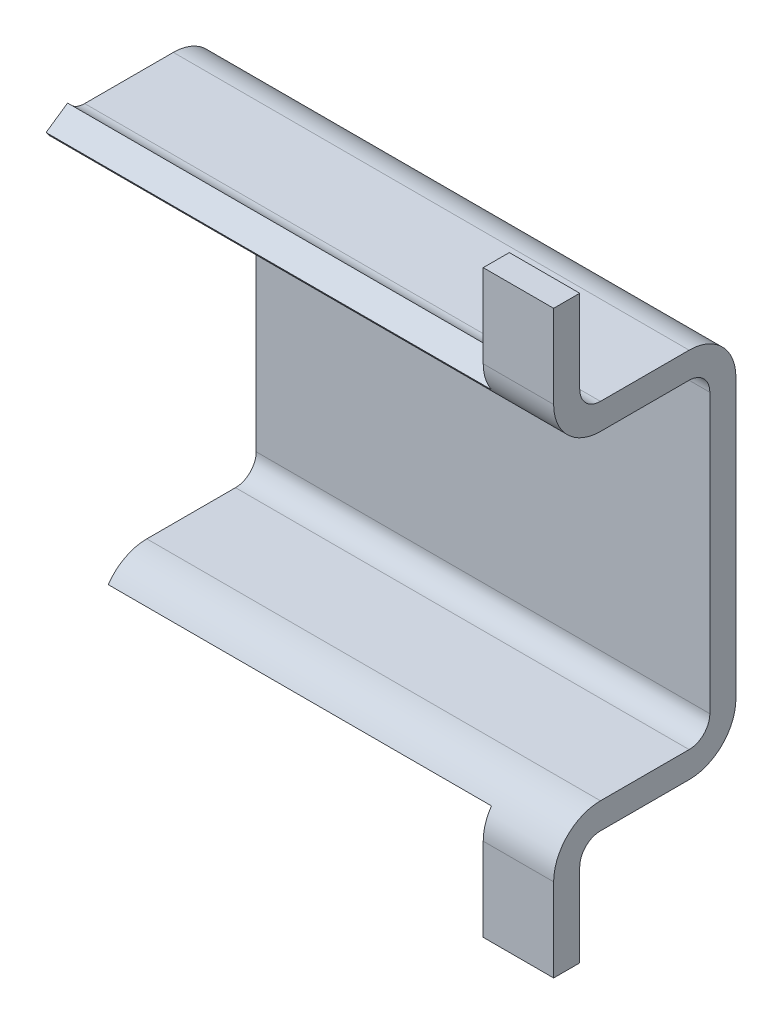
ISO-10303-21;
HEADER;
FILE_DESCRIPTION(('STEP AP214'),'2;1');
FILE_NAME('part.step','',(''),(''),'','','');
FILE_SCHEMA(('AUTOMOTIVE_DESIGN { 1 0 10303 214 1 1 1 1 }'));
ENDSEC;
DATA;
#1=APPLICATION_CONTEXT('core data for automotive mechanical design processes');
#2=APPLICATION_PROTOCOL_DEFINITION('international standard','automotive_design',2000,#1);
#3=PRODUCT_CONTEXT('',#1,'mechanical');
#4=PRODUCT('Part','Part','',(#3));
#5=PRODUCT_RELATED_PRODUCT_CATEGORY('part','',(#4));
#6=PRODUCT_DEFINITION_FORMATION('','',#4);
#7=PRODUCT_DEFINITION_CONTEXT('part definition',#1,'design');
#8=PRODUCT_DEFINITION('design','',#6,#7);
#9=PRODUCT_DEFINITION_SHAPE('','',#8);
#10=(LENGTH_UNIT() NAMED_UNIT(*) SI_UNIT(.MILLI.,.METRE.));
#11=(NAMED_UNIT(*) PLANE_ANGLE_UNIT() SI_UNIT($,.RADIAN.));
#12=(NAMED_UNIT(*) SI_UNIT($,.STERADIAN.) SOLID_ANGLE_UNIT());
#13=UNCERTAINTY_MEASURE_WITH_UNIT(LENGTH_MEASURE(1.E-05),#10,'distance_accuracy_value','');
#14=(GEOMETRIC_REPRESENTATION_CONTEXT(3) GLOBAL_UNCERTAINTY_ASSIGNED_CONTEXT((#13)) GLOBAL_UNIT_ASSIGNED_CONTEXT((#10,
#11,#12)) REPRESENTATION_CONTEXT('',''));
#15=CARTESIAN_POINT('',(0.,0.,0.));
#16=DIRECTION('',(0.,0.,1.));
#17=DIRECTION('',(1.,0.,0.));
#18=AXIS2_PLACEMENT_3D('',#15,#16,#17);
#19=CARTESIAN_POINT('',(0.,145.921134717466,-141.478874682535));
#20=DIRECTION('',(0.,1.,0.));
#21=DIRECTION('',(-1.,0.,0.));
#22=AXIS2_PLACEMENT_3D('',#19,#20,#21);
#23=PLANE('',#22);
#24=DIRECTION('',(1.,0.,0.));
#25=VECTOR('',#24,1.);
#26=CARTESIAN_POINT('',(0.,145.921134717465,33.5299812));
#27=LINE('',#26,#25);
#28=CARTESIAN_POINT('',(161.925,145.921134717465,33.5299812));
#29=VERTEX_POINT('',#28);
#30=CARTESIAN_POINT('',(320.04,145.921134717465,33.5299812));
#31=VERTEX_POINT('',#30);
#32=EDGE_CURVE('E289',#29,#31,#27,.T.);
#33=ORIENTED_EDGE('',*,*,#32,.T.);
#34=DIRECTION('',(0.,0.,1.));
#35=VECTOR('',#34,1.);
#36=CARTESIAN_POINT('',(320.04,145.921134717465,6.35));
#37=LINE('',#36,#35);
#38=CARTESIAN_POINT('',(320.04,145.921134717465,6.35));
#39=VERTEX_POINT('',#38);
#40=EDGE_CURVE('E493',#39,#31,#37,.T.);
#41=ORIENTED_EDGE('',*,*,#40,.F.);
#42=DIRECTION('',(1.,0.,0.));
#43=VECTOR('',#42,1.);
#44=CARTESIAN_POINT('',(0.,145.921134717465,6.35000000000005));
#45=LINE('',#44,#43);
#46=CARTESIAN_POINT('',(161.925,145.921134717465,6.35000000000005));
#47=VERTEX_POINT('',#46);
#48=EDGE_CURVE('E281',#47,#39,#45,.T.);
#49=ORIENTED_EDGE('',*,*,#48,.F.);
#50=DIRECTION('',(0.,0.,1.));
#51=VECTOR('',#50,1.);
#52=CARTESIAN_POINT('',(161.925,145.921134717466,-141.478874682535));
#53=LINE('',#52,#51);
#54=EDGE_CURVE('E233',#47,#29,#53,.T.);
#55=ORIENTED_EDGE('',*,*,#54,.T.);
#56=EDGE_LOOP('',(#33,#41,#49,#55));
#57=FACE_BOUND('',#56,.T.);
#58=ADVANCED_FACE('F43',(#57),#23,.T.);
#59=CARTESIAN_POINT('',(0.,137.921125317466,-141.478874682535));
#60=DIRECTION('',(0.,1.,0.));
#61=DIRECTION('',(-1.,0.,0.));
#62=AXIS2_PLACEMENT_3D('',#59,#60,#61);
#63=PLANE('',#62);
#64=DIRECTION('',(0.,0.,-1.));
#65=VECTOR('',#64,1.);
#66=CARTESIAN_POINT('',(320.04,137.921125317465,33.5299811999999));
#67=LINE('',#66,#65);
#68=CARTESIAN_POINT('',(320.04,137.921125317465,33.5299812));
#69=VERTEX_POINT('',#68);
#70=CARTESIAN_POINT('',(320.04,137.921125317465,6.35000000000001));
#71=VERTEX_POINT('',#70);
#72=EDGE_CURVE('E505',#69,#71,#67,.T.);
#73=ORIENTED_EDGE('',*,*,#72,.F.);
#74=DIRECTION('',(1.,0.,0.));
#75=VECTOR('',#74,1.);
#76=CARTESIAN_POINT('',(0.,137.921125317465,33.5299811999999));
#77=LINE('',#76,#75);
#78=CARTESIAN_POINT('',(161.925,137.921125317465,33.5299811999999));
#79=VERTEX_POINT('',#78);
#80=EDGE_CURVE('E266',#79,#69,#77,.T.);
#81=ORIENTED_EDGE('',*,*,#80,.F.);
#82=DIRECTION('',(0.,0.,1.));
#83=VECTOR('',#82,1.);
#84=CARTESIAN_POINT('',(161.925,137.921125317466,-141.478874682535));
#85=LINE('',#84,#83);
#86=CARTESIAN_POINT('',(161.925,137.921125317465,6.34999999999997));
#87=VERTEX_POINT('',#86);
#88=EDGE_CURVE('E236',#87,#79,#85,.T.);
#89=ORIENTED_EDGE('',*,*,#88,.F.);
#90=DIRECTION('',(1.,0.,0.));
#91=VECTOR('',#90,1.);
#92=CARTESIAN_POINT('',(0.,137.921125317465,6.34999999999997));
#93=LINE('',#92,#91);
#94=EDGE_CURVE('E287',#87,#71,#93,.T.);
#95=ORIENTED_EDGE('',*,*,#94,.T.);
#96=EDGE_LOOP('',(#73,#81,#89,#95));
#97=FACE_BOUND('',#96,.T.);
#98=ADVANCED_FACE('F563',(#97),#63,.F.);
#99=CARTESIAN_POINT('',(-225.848564164471,131.571125317465,6.35));
#100=DIRECTION('',(1.,0.,0.));
#101=DIRECTION('',(0.,0.,-1.));
#102=AXIS2_PLACEMENT_3D('',#99,#100,#101);
#103=CYLINDRICAL_SURFACE('',#102,14.3500094);
#104=ORIENTED_EDGE('',*,*,#48,.T.);
#105=CARTESIAN_POINT('',(320.04,131.571125317465,6.35));
#106=DIRECTION('',(1.,0.,0.));
#107=DIRECTION('',(0.,0.,-1.));
#108=AXIS2_PLACEMENT_3D('',#105,#106,#107);
#109=CIRCLE('',#108,14.3500094);
#110=CARTESIAN_POINT('',(320.04,131.571125317465,-8.0000094));
#111=VERTEX_POINT('',#110);
#112=EDGE_CURVE('E491',#111,#39,#109,.T.);
#113=ORIENTED_EDGE('',*,*,#112,.F.);
#114=DIRECTION('',(1.,0.,0.));
#115=VECTOR('',#114,1.);
#116=CARTESIAN_POINT('',(0.,131.571125317465,-8.0000094));
#117=LINE('',#116,#115);
#118=CARTESIAN_POINT('',(161.925,131.571125317465,-8.0000094));
#119=VERTEX_POINT('',#118);
#120=EDGE_CURVE('E284',#119,#111,#117,.T.);
#121=ORIENTED_EDGE('',*,*,#120,.F.);
#122=CARTESIAN_POINT('',(161.925,131.571125317465,6.35));
#123=DIRECTION('',(-1.,0.,0.));
#124=DIRECTION('',(0.,0.,1.));
#125=AXIS2_PLACEMENT_3D('',#122,#123,#124);
#126=CIRCLE('',#125,14.3500094);
#127=EDGE_CURVE('E230',#119,#47,#126,.F.);
#128=ORIENTED_EDGE('',*,*,#127,.T.);
#129=EDGE_LOOP('',(#104,#113,#121,#128));
#130=FACE_BOUND('',#129,.T.);
#131=ADVANCED_FACE('F546',(#130),#103,.T.);
#132=CARTESIAN_POINT('',(-225.848564164471,131.571125317465,6.35));
#133=DIRECTION('',(1.,0.,0.));
#134=DIRECTION('',(0.,0.,-1.));
#135=AXIS2_PLACEMENT_3D('',#132,#133,#134);
#136=CYLINDRICAL_SURFACE('',#135,6.35);
#137=CARTESIAN_POINT('',(320.04,131.571125317465,6.35));
#138=DIRECTION('',(-1.,0.,0.));
#139=DIRECTION('',(0.,0.,-1.));
#140=AXIS2_PLACEMENT_3D('',#137,#138,#139);
#141=CIRCLE('',#140,6.34999999999997);
#142=CARTESIAN_POINT('',(320.04,131.571125317465,0.));
#143=VERTEX_POINT('',#142);
#144=EDGE_CURVE('E507',#71,#143,#141,.T.);
#145=ORIENTED_EDGE('',*,*,#144,.F.);
#146=ORIENTED_EDGE('',*,*,#94,.F.);
#147=CARTESIAN_POINT('',(161.925,131.571125317465,6.35));
#148=DIRECTION('',(-1.,0.,0.));
#149=DIRECTION('',(0.,0.,1.));
#150=AXIS2_PLACEMENT_3D('',#147,#148,#149);
#151=CIRCLE('',#150,6.35);
#152=CARTESIAN_POINT('',(161.925,131.571125317465,0.));
#153=VERTEX_POINT('',#152);
#154=EDGE_CURVE('E239',#153,#87,#151,.F.);
#155=ORIENTED_EDGE('',*,*,#154,.F.);
#156=DIRECTION('',(1.,0.,0.));
#157=VECTOR('',#156,1.);
#158=CARTESIAN_POINT('',(0.,131.571125317465,0.));
#159=LINE('',#158,#157);
#160=EDGE_CURVE('E277',#153,#143,#159,.T.);
#161=ORIENTED_EDGE('',*,*,#160,.T.);
#162=EDGE_LOOP('',(#145,#146,#155,#161));
#163=FACE_BOUND('',#162,.T.);
#164=ADVANCED_FACE('F522',(#163),#136,.F.);
#165=CARTESIAN_POINT('',(-225.848564164472,152.271134717465,33.5299812000001));
#166=DIRECTION('',(1.,0.,0.));
#167=DIRECTION('',(0.,0.,-1.));
#168=AXIS2_PLACEMENT_3D('',#165,#166,#167);
#169=CYLINDRICAL_SURFACE('',#168,6.35);
#170=DIRECTION('',(1.,0.,0.));
#171=VECTOR('',#170,1.);
#172=CARTESIAN_POINT('',(0.,152.271134717465,39.8799812));
#173=LINE('',#172,#171);
#174=CARTESIAN_POINT('',(298.45,152.271134717465,39.8799812));
#175=VERTEX_POINT('',#174);
#176=CARTESIAN_POINT('',(320.04,152.271134717465,39.8799812000001));
#177=VERTEX_POINT('',#176);
#178=EDGE_CURVE('E269',#175,#177,#173,.T.);
#179=ORIENTED_EDGE('',*,*,#178,.T.);
#180=CARTESIAN_POINT('',(320.04,152.271134717465,33.5299812000001));
#181=DIRECTION('',(-1.,0.,0.));
#182=DIRECTION('',(0.,0.,-1.));
#183=AXIS2_PLACEMENT_3D('',#180,#181,#182);
#184=CIRCLE('',#183,6.34999999999999);
#185=EDGE_CURVE('E495',#31,#177,#184,.T.);
#186=ORIENTED_EDGE('',*,*,#185,.F.);
#187=ORIENTED_EDGE('',*,*,#32,.F.);
#188=CARTESIAN_POINT('',(161.925,152.271134717465,33.5299812000001));
#189=DIRECTION('',(-1.,0.,0.));
#190=DIRECTION('',(0.,0.,1.));
#191=AXIS2_PLACEMENT_3D('',#188,#189,#190);
#192=CIRCLE('',#191,6.35);
#193=CARTESIAN_POINT('',(161.925,148.680020281968,38.767002978756));
#194=VERTEX_POINT('',#193);
#195=EDGE_CURVE('E227',#29,#194,#192,.T.);
#196=ORIENTED_EDGE('',*,*,#195,.T.);
#197=DIRECTION('',(1.,0.,0.));
#198=VECTOR('',#197,1.);
#199=CARTESIAN_POINT('',(298.45,148.680020281968,38.767002978756));
#200=LINE('',#199,#198);
#201=CARTESIAN_POINT('',(298.45,148.680020281968,38.767002978756));
#202=VERTEX_POINT('',#201);
#203=EDGE_CURVE('E271',#194,#202,#200,.T.);
#204=ORIENTED_EDGE('',*,*,#203,.T.);
#205=CARTESIAN_POINT('',(298.45,152.271134717465,33.5299812000001));
#206=DIRECTION('',(-1.,0.,0.));
#207=DIRECTION('',(0.,0.,-1.));
#208=AXIS2_PLACEMENT_3D('',#205,#206,#207);
#209=CIRCLE('',#208,6.35);
#210=EDGE_CURVE('E274',#202,#175,#209,.T.);
#211=ORIENTED_EDGE('',*,*,#210,.T.);
#212=EDGE_LOOP('',(#179,#186,#187,#196,#204,#211));
#213=FACE_BOUND('',#212,.T.);
#214=ADVANCED_FACE('F541',(#213),#169,.F.);
#215=CARTESIAN_POINT('',(-225.848564164472,152.271134717465,33.5299812000001));
#216=DIRECTION('',(1.,0.,0.));
#217=DIRECTION('',(0.,0.,-1.));
#218=AXIS2_PLACEMENT_3D('',#215,#216,#217);
#219=CYLINDRICAL_SURFACE('',#218,14.3500094);
#220=CARTESIAN_POINT('',(320.04,152.271134717465,33.5299812000001));
#221=DIRECTION('',(1.,0.,0.));
#222=DIRECTION('',(0.,0.,-1.));
#223=AXIS2_PLACEMENT_3D('',#220,#221,#222);
#224=CIRCLE('',#223,14.3500094);
#225=CARTESIAN_POINT('',(320.04,152.271134717465,47.8799906000001));
#226=VERTEX_POINT('',#225);
#227=EDGE_CURVE('E503',#226,#69,#224,.T.);
#228=ORIENTED_EDGE('',*,*,#227,.F.);
#229=DIRECTION('',(1.,0.,0.));
#230=VECTOR('',#229,1.);
#231=CARTESIAN_POINT('',(0.,152.271134717465,47.8799906));
#232=LINE('',#231,#230);
#233=CARTESIAN_POINT('',(298.45,152.271134717465,47.8799906));
#234=VERTEX_POINT('',#233);
#235=EDGE_CURVE('E314',#234,#226,#232,.T.);
#236=ORIENTED_EDGE('',*,*,#235,.F.);
#237=CARTESIAN_POINT('',(298.45,152.271134717465,33.5299812000001));
#238=DIRECTION('',(1.,0.,0.));
#239=DIRECTION('',(0.,0.,-1.));
#240=AXIS2_PLACEMENT_3D('',#237,#238,#239);
#241=CIRCLE('',#240,14.3500094);
#242=CARTESIAN_POINT('',(298.45,144.155776307093,45.3648334445909));
#243=VERTEX_POINT('',#242);
#244=EDGE_CURVE('E328',#243,#234,#241,.F.);
#245=ORIENTED_EDGE('',*,*,#244,.F.);
#246=DIRECTION('',(1.,0.,0.));
#247=VECTOR('',#246,1.);
#248=CARTESIAN_POINT('',(-225.848564164472,144.155776307093,45.3648334445909));
#249=LINE('',#248,#247);
#250=CARTESIAN_POINT('',(161.925,144.155776307093,45.3648334445909));
#251=VERTEX_POINT('',#250);
#252=EDGE_CURVE('E275',#251,#243,#249,.T.);
#253=ORIENTED_EDGE('',*,*,#252,.F.);
#254=CARTESIAN_POINT('',(161.925,152.271134717465,33.5299812000001));
#255=DIRECTION('',(-1.,0.,0.));
#256=DIRECTION('',(0.,0.,1.));
#257=AXIS2_PLACEMENT_3D('',#254,#255,#256);
#258=CIRCLE('',#257,14.3500094);
#259=EDGE_CURVE('E242',#79,#251,#258,.T.);
#260=ORIENTED_EDGE('',*,*,#259,.F.);
#261=ORIENTED_EDGE('',*,*,#80,.T.);
#262=EDGE_LOOP('',(#228,#236,#245,#253,#260,#261));
#263=FACE_BOUND('',#262,.T.);
#264=ADVANCED_FACE('F529',(#263),#219,.T.);
#265=CARTESIAN_POINT('',(0.,0.,0.));
#266=DIRECTION('',(0.,0.,-1.));
#267=DIRECTION('',(-1.,0.,0.));
#268=AXIS2_PLACEMENT_3D('',#265,#266,#267);
#269=PLANE('',#268);
#270=DIRECTION('',(0.,-1.,0.));
#271=VECTOR('',#270,1.);
#272=CARTESIAN_POINT('',(320.04,131.571125317465,0.));
#273=LINE('',#272,#271);
#274=CARTESIAN_POINT('',(320.04,46.228874682535,0.));
#275=VERTEX_POINT('',#274);
#276=EDGE_CURVE('E509',#143,#275,#273,.T.);
#277=ORIENTED_EDGE('',*,*,#276,.F.);
#278=ORIENTED_EDGE('',*,*,#160,.F.);
#279=DIRECTION('',(0.,1.,0.));
#280=VECTOR('',#279,1.);
#281=CARTESIAN_POINT('',(161.925,0.,0.));
#282=LINE('',#281,#280);
#283=CARTESIAN_POINT('',(161.925,118.019979718032,0.));
#284=VERTEX_POINT('',#283);
#285=EDGE_CURVE('E245',#284,#153,#282,.T.);
#286=ORIENTED_EDGE('',*,*,#285,.F.);
#287=CARTESIAN_POINT('',(161.925,98.9699797180323,0.));
#288=DIRECTION('',(0.,0.,-1.));
#289=DIRECTION('',(-1.,0.,0.));
#290=AXIS2_PLACEMENT_3D('',#287,#288,#289);
#291=CIRCLE('',#290,19.05);
#292=CARTESIAN_POINT('',(180.975,98.9699797180323,0.));
#293=VERTEX_POINT('',#292);
#294=EDGE_CURVE('E173',#284,#293,#291,.T.);
#295=ORIENTED_EDGE('',*,*,#294,.T.);
#296=DIRECTION('',(0.,1.,0.));
#297=VECTOR('',#296,1.);
#298=CARTESIAN_POINT('',(180.975,0.,0.));
#299=LINE('',#298,#297);
#300=CARTESIAN_POINT('',(180.975,46.228874682535,0.));
#301=VERTEX_POINT('',#300);
#302=EDGE_CURVE('E147',#301,#293,#299,.T.);
#303=ORIENTED_EDGE('',*,*,#302,.F.);
#304=DIRECTION('',(1.,0.,0.));
#305=VECTOR('',#304,1.);
#306=CARTESIAN_POINT('',(0.,46.228874682535,0.));
#307=LINE('',#306,#305);
#308=EDGE_CURVE('E259',#301,#275,#307,.T.);
#309=ORIENTED_EDGE('',*,*,#308,.T.);
#310=EDGE_LOOP('',(#277,#278,#286,#295,#303,#309));
#311=FACE_BOUND('',#310,.T.);
#312=ADVANCED_FACE('F362',(#311),#269,.F.);
#313=CARTESIAN_POINT('',(0.,0.,-8.0000094));
#314=DIRECTION('',(0.,0.,-1.));
#315=DIRECTION('',(-1.,0.,0.));
#316=AXIS2_PLACEMENT_3D('',#313,#314,#315);
#317=PLANE('',#316);
#318=ORIENTED_EDGE('',*,*,#120,.T.);
#319=DIRECTION('',(0.,1.,0.));
#320=VECTOR('',#319,1.);
#321=CARTESIAN_POINT('',(320.04,46.228874682535,-8.0000094));
#322=LINE('',#321,#320);
#323=CARTESIAN_POINT('',(320.04,46.228874682535,-8.0000094));
#324=VERTEX_POINT('',#323);
#325=EDGE_CURVE('E489',#324,#111,#322,.T.);
#326=ORIENTED_EDGE('',*,*,#325,.F.);
#327=DIRECTION('',(1.,0.,0.));
#328=VECTOR('',#327,1.);
#329=CARTESIAN_POINT('',(0.,46.228874682535,-8.0000094));
#330=LINE('',#329,#328);
#331=CARTESIAN_POINT('',(180.975,46.228874682535,-8.0000094));
#332=VERTEX_POINT('',#331);
#333=EDGE_CURVE('E262',#332,#324,#330,.T.);
#334=ORIENTED_EDGE('',*,*,#333,.F.);
#335=DIRECTION('',(0.,1.,0.));
#336=VECTOR('',#335,1.);
#337=CARTESIAN_POINT('',(180.975,0.,-8.0000094));
#338=LINE('',#337,#336);
#339=CARTESIAN_POINT('',(180.975,98.9699797180323,-8.0000094));
#340=VERTEX_POINT('',#339);
#341=EDGE_CURVE('E174',#332,#340,#338,.T.);
#342=ORIENTED_EDGE('',*,*,#341,.T.);
#343=CARTESIAN_POINT('',(161.925,98.9699797180323,-8.0000094));
#344=DIRECTION('',(0.,0.,-1.));
#345=DIRECTION('',(-1.,0.,0.));
#346=AXIS2_PLACEMENT_3D('',#343,#344,#345);
#347=CIRCLE('',#346,19.05);
#348=CARTESIAN_POINT('',(161.925,118.019979718032,-8.0000094));
#349=VERTEX_POINT('',#348);
#350=EDGE_CURVE('E69',#349,#340,#347,.T.);
#351=ORIENTED_EDGE('',*,*,#350,.F.);
#352=DIRECTION('',(0.,1.,0.));
#353=VECTOR('',#352,1.);
#354=CARTESIAN_POINT('',(161.925,0.,-8.0000094));
#355=LINE('',#354,#353);
#356=EDGE_CURVE('E224',#349,#119,#355,.T.);
#357=ORIENTED_EDGE('',*,*,#356,.T.);
#358=EDGE_LOOP('',(#318,#326,#334,#342,#351,#357));
#359=FACE_BOUND('',#358,.T.);
#360=ADVANCED_FACE('F381',(#359),#317,.T.);
#361=CARTESIAN_POINT('',(549.698564164471,46.228874682535,6.35));
#362=DIRECTION('',(-1.,0.,0.));
#363=DIRECTION('',(0.,0.,1.));
#364=AXIS2_PLACEMENT_3D('',#361,#362,#363);
#365=CYLINDRICAL_SURFACE('',#364,14.3500094);
#366=ORIENTED_EDGE('',*,*,#333,.T.);
#367=CARTESIAN_POINT('',(320.04,46.228874682535,6.35));
#368=DIRECTION('',(1.,0.,0.));
#369=DIRECTION('',(0.,0.,-1.));
#370=AXIS2_PLACEMENT_3D('',#367,#368,#369);
#371=CIRCLE('',#370,14.3500094);
#372=CARTESIAN_POINT('',(320.04,31.878865282535,6.35000000000001));
#373=VERTEX_POINT('',#372);
#374=EDGE_CURVE('E487',#373,#324,#371,.T.);
#375=ORIENTED_EDGE('',*,*,#374,.F.);
#376=DIRECTION('',(1.,0.,0.));
#377=VECTOR('',#376,1.);
#378=CARTESIAN_POINT('',(0.,31.878865282535,6.35000000000005));
#379=LINE('',#378,#377);
#380=CARTESIAN_POINT('',(180.975,31.878865282535,6.35000000000005));
#381=VERTEX_POINT('',#380);
#382=EDGE_CURVE('E290',#381,#373,#379,.T.);
#383=ORIENTED_EDGE('',*,*,#382,.F.);
#384=CARTESIAN_POINT('',(180.975,46.228874682535,6.35));
#385=DIRECTION('',(-1.,0.,0.));
#386=DIRECTION('',(0.,-1.,0.));
#387=AXIS2_PLACEMENT_3D('',#384,#385,#386);
#388=CIRCLE('',#387,14.3500094);
#389=EDGE_CURVE('E182',#381,#332,#388,.F.);
#390=ORIENTED_EDGE('',*,*,#389,.T.);
#391=EDGE_LOOP('',(#366,#375,#383,#390));
#392=FACE_BOUND('',#391,.T.);
#393=ADVANCED_FACE('F550',(#392),#365,.T.);
#394=CARTESIAN_POINT('',(549.698564164471,46.228874682535,6.35));
#395=DIRECTION('',(-1.,0.,0.));
#396=DIRECTION('',(0.,0.,1.));
#397=AXIS2_PLACEMENT_3D('',#394,#395,#396);
#398=CYLINDRICAL_SURFACE('',#397,6.35);
#399=CARTESIAN_POINT('',(320.04,46.228874682535,6.35));
#400=DIRECTION('',(-1.,0.,0.));
#401=DIRECTION('',(0.,0.,-1.));
#402=AXIS2_PLACEMENT_3D('',#399,#400,#401);
#403=CIRCLE('',#402,6.35);
#404=CARTESIAN_POINT('',(320.04,39.878874682535,6.34999999999999));
#405=VERTEX_POINT('',#404);
#406=EDGE_CURVE('E511',#275,#405,#403,.T.);
#407=ORIENTED_EDGE('',*,*,#406,.F.);
#408=ORIENTED_EDGE('',*,*,#308,.F.);
#409=CARTESIAN_POINT('',(180.975,46.228874682535,6.35));
#410=DIRECTION('',(-1.,0.,0.));
#411=DIRECTION('',(0.,-1.,0.));
#412=AXIS2_PLACEMENT_3D('',#409,#410,#411);
#413=CIRCLE('',#412,6.35);
#414=CARTESIAN_POINT('',(180.975,39.878874682535,6.35000000000008));
#415=VERTEX_POINT('',#414);
#416=EDGE_CURVE('E216',#415,#301,#413,.F.);
#417=ORIENTED_EDGE('',*,*,#416,.F.);
#418=DIRECTION('',(1.,0.,0.));
#419=VECTOR('',#418,1.);
#420=CARTESIAN_POINT('',(0.,39.878874682535,6.35000000000008));
#421=LINE('',#420,#419);
#422=EDGE_CURVE('E167',#415,#405,#421,.T.);
#423=ORIENTED_EDGE('',*,*,#422,.T.);
#424=EDGE_LOOP('',(#407,#408,#417,#423));
#425=FACE_BOUND('',#424,.T.);
#426=ADVANCED_FACE('F356',(#425),#398,.F.);
#427=CARTESIAN_POINT('',(0.,31.8788652825351,36.3211253174651));
#428=DIRECTION('',(0.,-1.,0.));
#429=DIRECTION('',(-1.,0.,0.));
#430=AXIS2_PLACEMENT_3D('',#427,#428,#429);
#431=PLANE('',#430);
#432=ORIENTED_EDGE('',*,*,#382,.T.);
#433=DIRECTION('',(0.,0.,-1.));
#434=VECTOR('',#433,1.);
#435=CARTESIAN_POINT('',(320.04,31.8788652825351,33.5299812000001));
#436=LINE('',#435,#434);
#437=CARTESIAN_POINT('',(320.04,31.8788652825351,33.5299812000001));
#438=VERTEX_POINT('',#437);
#439=EDGE_CURVE('E485',#438,#373,#436,.T.);
#440=ORIENTED_EDGE('',*,*,#439,.F.);
#441=DIRECTION('',(1.,0.,0.));
#442=VECTOR('',#441,1.);
#443=CARTESIAN_POINT('',(0.,31.8788652825351,33.5299812000001));
#444=LINE('',#443,#442);
#445=CARTESIAN_POINT('',(180.975,31.8788652825351,33.5299812000001));
#446=VERTEX_POINT('',#445);
#447=EDGE_CURVE('E257',#446,#438,#444,.T.);
#448=ORIENTED_EDGE('',*,*,#447,.F.);
#449=DIRECTION('',(0.,0.,-1.));
#450=VECTOR('',#449,1.);
#451=CARTESIAN_POINT('',(180.975,31.8788652825351,36.3211253174651));
#452=LINE('',#451,#450);
#453=EDGE_CURVE('E148',#446,#381,#452,.T.);
#454=ORIENTED_EDGE('',*,*,#453,.T.);
#455=EDGE_LOOP('',(#432,#440,#448,#454));
#456=FACE_BOUND('',#455,.T.);
#457=ADVANCED_FACE('F551',(#456),#431,.T.);
#458=CARTESIAN_POINT('',(0.,39.8788746825351,36.3211253174651));
#459=DIRECTION('',(0.,-1.,0.));
#460=DIRECTION('',(-1.,0.,0.));
#461=AXIS2_PLACEMENT_3D('',#458,#459,#460);
#462=PLANE('',#461);
#463=DIRECTION('',(0.,0.,1.));
#464=VECTOR('',#463,1.);
#465=CARTESIAN_POINT('',(320.04,39.878874682535,6.34999999999999));
#466=LINE('',#465,#464);
#467=CARTESIAN_POINT('',(320.04,39.878874682535,33.5299812));
#468=VERTEX_POINT('',#467);
#469=EDGE_CURVE('E513',#405,#468,#466,.T.);
#470=ORIENTED_EDGE('',*,*,#469,.F.);
#471=ORIENTED_EDGE('',*,*,#422,.F.);
#472=DIRECTION('',(0.,0.,-1.));
#473=VECTOR('',#472,1.);
#474=CARTESIAN_POINT('',(180.975,39.8788746825351,36.3211253174651));
#475=LINE('',#474,#473);
#476=CARTESIAN_POINT('',(180.975,39.8788746825351,33.5299812000001));
#477=VERTEX_POINT('',#476);
#478=EDGE_CURVE('E157',#477,#415,#475,.T.);
#479=ORIENTED_EDGE('',*,*,#478,.F.);
#480=DIRECTION('',(1.,0.,0.));
#481=VECTOR('',#480,1.);
#482=CARTESIAN_POINT('',(0.,39.8788746825351,33.5299812000001));
#483=LINE('',#482,#481);
#484=EDGE_CURVE('E254',#477,#468,#483,.T.);
#485=ORIENTED_EDGE('',*,*,#484,.T.);
#486=EDGE_LOOP('',(#470,#471,#479,#485));
#487=FACE_BOUND('',#486,.T.);
#488=ADVANCED_FACE('F347',(#487),#462,.F.);
#489=CARTESIAN_POINT('',(549.698564164471,25.5288652825351,33.5299812000001));
#490=DIRECTION('',(-1.,0.,0.));
#491=DIRECTION('',(0.,0.,1.));
#492=AXIS2_PLACEMENT_3D('',#489,#490,#491);
#493=CYLINDRICAL_SURFACE('',#492,6.35);
#494=ORIENTED_EDGE('',*,*,#447,.T.);
#495=CARTESIAN_POINT('',(320.04,25.5288652825351,33.5299812000001));
#496=DIRECTION('',(-1.,0.,0.));
#497=DIRECTION('',(0.,0.,-1.));
#498=AXIS2_PLACEMENT_3D('',#495,#496,#497);
#499=CIRCLE('',#498,6.34999999999996);
#500=CARTESIAN_POINT('',(320.04,29.1199797180472,38.7670029787457));
#501=VERTEX_POINT('',#500);
#502=EDGE_CURVE('E481',#501,#438,#499,.T.);
#503=ORIENTED_EDGE('',*,*,#502,.F.);
#504=DIRECTION('',(0.,0.825370763980531,-0.564591092708868));
#505=VECTOR('',#504,1.);
#506=CARTESIAN_POINT('',(320.04,29.1080530831459,38.7751613387521));
#507=LINE('',#506,#505);
#508=CARTESIAN_POINT('',(320.04,29.1080530831459,38.7751613387521));
#509=VERTEX_POINT('',#508);
#510=EDGE_CURVE('E479',#509,#501,#507,.T.);
#511=ORIENTED_EDGE('',*,*,#510,.F.);
#512=CARTESIAN_POINT('',(320.04,25.5288652825351,33.5299812000001));
#513=DIRECTION('',(-1.,0.,0.));
#514=DIRECTION('',(0.,0.,-1.));
#515=AXIS2_PLACEMENT_3D('',#512,#513,#514);
#516=CIRCLE('',#515,6.34999999999998);
#517=CARTESIAN_POINT('',(320.04,25.5288652825353,39.8799812000001));
#518=VERTEX_POINT('',#517);
#519=EDGE_CURVE('E472',#518,#509,#516,.T.);
#520=ORIENTED_EDGE('',*,*,#519,.F.);
#521=DIRECTION('',(1.,0.,0.));
#522=VECTOR('',#521,1.);
#523=CARTESIAN_POINT('',(0.,25.5288652825352,39.8799812000001));
#524=LINE('',#523,#522);
#525=CARTESIAN_POINT('',(298.45,25.5288652825351,39.8799812000001));
#526=VERTEX_POINT('',#525);
#527=EDGE_CURVE('E193',#526,#518,#524,.T.);
#528=ORIENTED_EDGE('',*,*,#527,.F.);
#529=CARTESIAN_POINT('',(298.45,25.5288652825351,33.5299812000001));
#530=DIRECTION('',(-1.,0.,0.));
#531=DIRECTION('',(0.,0.,-1.));
#532=AXIS2_PLACEMENT_3D('',#529,#530,#531);
#533=CIRCLE('',#532,6.35);
#534=CARTESIAN_POINT('',(298.45,29.1199797180323,38.767002978756));
#535=VERTEX_POINT('',#534);
#536=EDGE_CURVE('E163',#526,#535,#533,.T.);
#537=ORIENTED_EDGE('',*,*,#536,.T.);
#538=DIRECTION('',(-1.,0.,0.));
#539=VECTOR('',#538,1.);
#540=CARTESIAN_POINT('',(25.4000000000002,29.1199797180323,38.767002978756));
#541=LINE('',#540,#539);
#542=CARTESIAN_POINT('',(180.975,29.1199797180323,38.767002978756));
#543=VERTEX_POINT('',#542);
#544=EDGE_CURVE('E154',#535,#543,#541,.T.);
#545=ORIENTED_EDGE('',*,*,#544,.T.);
#546=CARTESIAN_POINT('',(180.975,25.5288652825351,33.5299812000001));
#547=DIRECTION('',(-1.,0.,0.));
#548=DIRECTION('',(0.,-1.,0.));
#549=AXIS2_PLACEMENT_3D('',#546,#547,#548);
#550=CIRCLE('',#549,6.35);
#551=EDGE_CURVE('E136',#543,#446,#550,.T.);
#552=ORIENTED_EDGE('',*,*,#551,.T.);
#553=EDGE_LOOP('',(#494,#503,#511,#520,#528,#537,#545,#552));
#554=FACE_BOUND('',#553,.T.);
#555=ADVANCED_FACE('F160',(#554),#493,.F.);
#556=CARTESIAN_POINT('',(549.698564164471,25.5288652825351,33.5299812000001));
#557=DIRECTION('',(-1.,0.,0.));
#558=DIRECTION('',(0.,0.,1.));
#559=AXIS2_PLACEMENT_3D('',#556,#557,#558);
#560=CYLINDRICAL_SURFACE('',#559,14.3500094);
#561=CARTESIAN_POINT('',(320.04,25.5288652825351,33.5299812000001));
#562=DIRECTION('',(1.,0.,0.));
#563=DIRECTION('',(0.,0.,-1.));
#564=AXIS2_PLACEMENT_3D('',#561,#562,#563);
#565=CIRCLE('',#564,14.3500093999999);
#566=CARTESIAN_POINT('',(320.04,33.6442236929067,45.364833444591));
#567=VERTEX_POINT('',#566);
#568=EDGE_CURVE('E515',#468,#567,#565,.T.);
#569=ORIENTED_EDGE('',*,*,#568,.F.);
#570=ORIENTED_EDGE('',*,*,#484,.F.);
#571=CARTESIAN_POINT('',(180.975,25.5288652825351,33.5299812000001));
#572=DIRECTION('',(-1.,0.,0.));
#573=DIRECTION('',(0.,-1.,0.));
#574=AXIS2_PLACEMENT_3D('',#571,#572,#573);
#575=CIRCLE('',#574,14.3500094);
#576=CARTESIAN_POINT('',(180.975,33.6442236929067,45.364833444591));
#577=VERTEX_POINT('',#576);
#578=EDGE_CURVE('E252',#577,#477,#575,.T.);
#579=ORIENTED_EDGE('',*,*,#578,.F.);
#580=DIRECTION('',(-1.,0.,0.));
#581=VECTOR('',#580,1.);
#582=CARTESIAN_POINT('',(549.698564164471,33.6442236929067,45.364833444591));
#583=LINE('',#582,#581);
#584=CARTESIAN_POINT('',(298.45,33.6442236929067,45.364833444591));
#585=VERTEX_POINT('',#584);
#586=EDGE_CURVE('E156',#585,#577,#583,.T.);
#587=ORIENTED_EDGE('',*,*,#586,.F.);
#588=CARTESIAN_POINT('',(298.45,25.5288652825351,33.5299812000001));
#589=DIRECTION('',(-1.,0.,0.));
#590=DIRECTION('',(0.,0.,1.));
#591=AXIS2_PLACEMENT_3D('',#588,#589,#590);
#592=CIRCLE('',#591,14.3500094);
#593=CARTESIAN_POINT('',(298.45,25.5288652825351,47.8799906000001));
#594=VERTEX_POINT('',#593);
#595=EDGE_CURVE('E172',#594,#585,#592,.T.);
#596=ORIENTED_EDGE('',*,*,#595,.F.);
#597=DIRECTION('',(1.,0.,0.));
#598=VECTOR('',#597,1.);
#599=CARTESIAN_POINT('',(0.,25.5288652825351,47.8799906000001));
#600=LINE('',#599,#598);
#601=CARTESIAN_POINT('',(320.04,25.5288652825353,47.8799906000001));
#602=VERTEX_POINT('',#601);
#603=EDGE_CURVE('E175',#594,#602,#600,.T.);
#604=ORIENTED_EDGE('',*,*,#603,.T.);
#605=CARTESIAN_POINT('',(320.04,25.5288652825351,33.5299812000001));
#606=DIRECTION('',(1.,0.,0.));
#607=DIRECTION('',(0.,0.,-1.));
#608=AXIS2_PLACEMENT_3D('',#605,#606,#607);
#609=CIRCLE('',#608,14.3500094);
#610=CARTESIAN_POINT('',(320.04,33.6172713586185,45.3832700654781));
#611=VERTEX_POINT('',#610);
#612=EDGE_CURVE('E519',#611,#602,#609,.T.);
#613=ORIENTED_EDGE('',*,*,#612,.F.);
#614=DIRECTION('',(0.,-0.825370763981725,0.564591092707124));
#615=VECTOR('',#614,1.);
#616=CARTESIAN_POINT('',(320.04,33.6442236929067,45.364833444591));
#617=LINE('',#616,#615);
#618=EDGE_CURVE('E305',#567,#611,#617,.T.);
#619=ORIENTED_EDGE('',*,*,#618,.F.);
#620=EDGE_LOOP('',(#569,#570,#579,#587,#596,#604,#613,#619));
#621=FACE_BOUND('',#620,.T.);
#622=ADVANCED_FACE('F341',(#621),#560,.T.);
#623=CARTESIAN_POINT('',(298.45,177.8,39.8799812000001));
#624=DIRECTION('',(0.,1.,0.));
#625=DIRECTION('',(-1.,0.,0.));
#626=AXIS2_PLACEMENT_3D('',#623,#624,#625);
#627=PLANE('',#626);
#628=DIRECTION('',(-1.,0.,0.));
#629=VECTOR('',#628,1.);
#630=CARTESIAN_POINT('',(298.45,177.8,47.8799906));
#631=LINE('',#630,#629);
#632=CARTESIAN_POINT('',(320.04,177.8,47.8799906));
#633=VERTEX_POINT('',#632);
#634=CARTESIAN_POINT('',(298.45,177.8,47.8799906));
#635=VERTEX_POINT('',#634);
#636=EDGE_CURVE('E265',#633,#635,#631,.T.);
#637=ORIENTED_EDGE('',*,*,#636,.F.);
#638=DIRECTION('',(0.,0.,1.));
#639=VECTOR('',#638,1.);
#640=CARTESIAN_POINT('',(320.04,177.8,39.8799812));
#641=LINE('',#640,#639);
#642=CARTESIAN_POINT('',(320.04,177.8,39.8799812));
#643=VERTEX_POINT('',#642);
#644=EDGE_CURVE('E499',#643,#633,#641,.T.);
#645=ORIENTED_EDGE('',*,*,#644,.F.);
#646=DIRECTION('',(-1.,0.,0.));
#647=VECTOR('',#646,1.);
#648=CARTESIAN_POINT('',(298.45,177.8,39.8799812000001));
#649=LINE('',#648,#647);
#650=CARTESIAN_POINT('',(298.45,177.8,39.8799812000001));
#651=VERTEX_POINT('',#650);
#652=EDGE_CURVE('E270',#643,#651,#649,.T.);
#653=ORIENTED_EDGE('',*,*,#652,.T.);
#654=DIRECTION('',(0.,0.,1.));
#655=VECTOR('',#654,1.);
#656=CARTESIAN_POINT('',(298.45,177.8,39.8799812000001));
#657=LINE('',#656,#655);
#658=EDGE_CURVE('E322',#651,#635,#657,.T.);
#659=ORIENTED_EDGE('',*,*,#658,.T.);
#660=EDGE_LOOP('',(#637,#645,#653,#659));
#661=FACE_BOUND('',#660,.T.);
#662=ADVANCED_FACE('F681',(#661),#627,.T.);
#663=CARTESIAN_POINT('',(0.,-38.99547053014,39.8799812));
#664=DIRECTION('',(0.,0.,-1.));
#665=DIRECTION('',(-1.,0.,0.));
#666=AXIS2_PLACEMENT_3D('',#663,#664,#665);
#667=PLANE('',#666);
#668=ORIENTED_EDGE('',*,*,#652,.F.);
#669=DIRECTION('',(0.,1.,0.));
#670=VECTOR('',#669,1.);
#671=CARTESIAN_POINT('',(320.04,152.271134717465,39.8799812000001));
#672=LINE('',#671,#670);
#673=EDGE_CURVE('E497',#177,#643,#672,.T.);
#674=ORIENTED_EDGE('',*,*,#673,.F.);
#675=ORIENTED_EDGE('',*,*,#178,.F.);
#676=DIRECTION('',(0.,-1.,0.));
#677=VECTOR('',#676,1.);
#678=CARTESIAN_POINT('',(298.45,146.05,39.8799812000001));
#679=LINE('',#678,#677);
#680=EDGE_CURVE('E319',#651,#175,#679,.T.);
#681=ORIENTED_EDGE('',*,*,#680,.F.);
#682=EDGE_LOOP('',(#668,#674,#675,#681));
#683=FACE_BOUND('',#682,.T.);
#684=ADVANCED_FACE('F690',(#683),#667,.T.);
#685=CARTESIAN_POINT('',(0.,-38.99547053014,47.8799906));
#686=DIRECTION('',(0.,0.,-1.));
#687=DIRECTION('',(-1.,0.,0.));
#688=AXIS2_PLACEMENT_3D('',#685,#686,#687);
#689=PLANE('',#688);
#690=DIRECTION('',(0.,-1.,0.));
#691=VECTOR('',#690,1.);
#692=CARTESIAN_POINT('',(320.04,177.8,47.8799906));
#693=LINE('',#692,#691);
#694=EDGE_CURVE('E501',#633,#226,#693,.T.);
#695=ORIENTED_EDGE('',*,*,#694,.F.);
#696=ORIENTED_EDGE('',*,*,#636,.T.);
#697=DIRECTION('',(0.,-1.,0.));
#698=VECTOR('',#697,1.);
#699=CARTESIAN_POINT('',(298.45,146.05,47.8799906));
#700=LINE('',#699,#698);
#701=EDGE_CURVE('E317',#635,#234,#700,.T.);
#702=ORIENTED_EDGE('',*,*,#701,.T.);
#703=ORIENTED_EDGE('',*,*,#235,.T.);
#704=EDGE_LOOP('',(#695,#696,#702,#703));
#705=FACE_BOUND('',#704,.T.);
#706=ADVANCED_FACE('F699',(#705),#689,.F.);
#707=CARTESIAN_POINT('',(0.,38.99547053014,39.8799812000001));
#708=DIRECTION('',(0.,0.,-1.));
#709=DIRECTION('',(-1.,0.,0.));
#710=AXIS2_PLACEMENT_3D('',#707,#708,#709);
#711=PLANE('',#710);
#712=ORIENTED_EDGE('',*,*,#527,.T.);
#713=DIRECTION('',(0.,1.,0.));
#714=VECTOR('',#713,1.);
#715=CARTESIAN_POINT('',(320.04,1.66533453693773E-13,39.8799812000001));
#716=LINE('',#715,#714);
#717=CARTESIAN_POINT('',(320.04,1.66533453693773E-13,39.8799812000001));
#718=VERTEX_POINT('',#717);
#719=EDGE_CURVE('E463',#718,#518,#716,.T.);
#720=ORIENTED_EDGE('',*,*,#719,.F.);
#721=DIRECTION('',(1.,0.,0.));
#722=VECTOR('',#721,1.);
#723=CARTESIAN_POINT('',(323.85,1.66533453693773E-13,39.8799812000001));
#724=LINE('',#723,#722);
#725=CARTESIAN_POINT('',(298.45,1.66533453693773E-13,39.8799812000001));
#726=VERTEX_POINT('',#725);
#727=EDGE_CURVE('E185',#726,#718,#724,.T.);
#728=ORIENTED_EDGE('',*,*,#727,.F.);
#729=DIRECTION('',(0.,-1.,0.));
#730=VECTOR('',#729,1.);
#731=CARTESIAN_POINT('',(298.45,1.66533453693773E-13,39.8799812000001));
#732=LINE('',#731,#730);
#733=EDGE_CURVE('E206',#526,#726,#732,.T.);
#734=ORIENTED_EDGE('',*,*,#733,.F.);
#735=EDGE_LOOP('',(#712,#720,#728,#734));
#736=FACE_BOUND('',#735,.T.);
#737=ADVANCED_FACE('F470',(#736),#711,.T.);
#738=CARTESIAN_POINT('',(0.,38.99547053014,47.8799906000001));
#739=DIRECTION('',(0.,0.,-1.));
#740=DIRECTION('',(-1.,0.,0.));
#741=AXIS2_PLACEMENT_3D('',#738,#739,#740);
#742=PLANE('',#741);
#743=DIRECTION('',(0.,-1.,0.));
#744=VECTOR('',#743,1.);
#745=CARTESIAN_POINT('',(320.04,25.5288652825353,47.8799906000001));
#746=LINE('',#745,#744);
#747=CARTESIAN_POINT('',(320.04,1.6601303665098E-13,47.8799906000001));
#748=VERTEX_POINT('',#747);
#749=EDGE_CURVE('E60',#602,#748,#746,.T.);
#750=ORIENTED_EDGE('',*,*,#749,.F.);
#751=ORIENTED_EDGE('',*,*,#603,.F.);
#752=DIRECTION('',(0.,-1.,0.));
#753=VECTOR('',#752,1.);
#754=CARTESIAN_POINT('',(298.45,1.66533453693773E-13,47.8799906000001));
#755=LINE('',#754,#753);
#756=CARTESIAN_POINT('',(298.45,1.66533453693773E-13,47.8799906000001));
#757=VERTEX_POINT('',#756);
#758=EDGE_CURVE('E199',#594,#757,#755,.T.);
#759=ORIENTED_EDGE('',*,*,#758,.T.);
#760=DIRECTION('',(1.,0.,0.));
#761=VECTOR('',#760,1.);
#762=CARTESIAN_POINT('',(323.85,1.66533453693773E-13,47.8799906000001));
#763=LINE('',#762,#761);
#764=EDGE_CURVE('E201',#757,#748,#763,.T.);
#765=ORIENTED_EDGE('',*,*,#764,.T.);
#766=EDGE_LOOP('',(#750,#751,#759,#765));
#767=FACE_BOUND('',#766,.T.);
#768=ADVANCED_FACE('F718',(#767),#742,.F.);
#769=CARTESIAN_POINT('',(323.85,1.66533453693773E-13,39.8799812000001));
#770=DIRECTION('',(0.,-1.,0.));
#771=DIRECTION('',(1.,0.,0.));
#772=AXIS2_PLACEMENT_3D('',#769,#770,#771);
#773=PLANE('',#772);
#774=ORIENTED_EDGE('',*,*,#727,.T.);
#775=DIRECTION('',(0.,0.,-1.));
#776=VECTOR('',#775,1.);
#777=CARTESIAN_POINT('',(320.04,1.66533453693773E-13,47.8799906000001));
#778=LINE('',#777,#776);
#779=EDGE_CURVE('E459',#748,#718,#778,.T.);
#780=ORIENTED_EDGE('',*,*,#779,.F.);
#781=ORIENTED_EDGE('',*,*,#764,.F.);
#782=DIRECTION('',(0.,0.,1.));
#783=VECTOR('',#782,1.);
#784=CARTESIAN_POINT('',(298.45,1.66533453693773E-13,39.8799812000001));
#785=LINE('',#784,#783);
#786=EDGE_CURVE('E208',#726,#757,#785,.T.);
#787=ORIENTED_EDGE('',*,*,#786,.F.);
#788=EDGE_LOOP('',(#774,#780,#781,#787));
#789=FACE_BOUND('',#788,.T.);
#790=ADVANCED_FACE('F475',(#789),#773,.T.);
#791=CARTESIAN_POINT('',(161.925,13.8318679814657,47.8899906000001));
#792=DIRECTION('',(-1.,0.,0.));
#793=DIRECTION('',(0.,0.,1.));
#794=AXIS2_PLACEMENT_3D('',#791,#792,#793);
#795=PLANE('',#794);
#796=ORIENTED_EDGE('',*,*,#127,.F.);
#797=ORIENTED_EDGE('',*,*,#356,.F.);
#798=DIRECTION('',(0.,0.,-1.));
#799=VECTOR('',#798,1.);
#800=CARTESIAN_POINT('',(161.925,118.019979718032,47.8799906));
#801=LINE('',#800,#799);
#802=EDGE_CURVE('E248',#349,#284,#801,.F.);
#803=ORIENTED_EDGE('',*,*,#802,.T.);
#804=ORIENTED_EDGE('',*,*,#285,.T.);
#805=ORIENTED_EDGE('',*,*,#154,.T.);
#806=ORIENTED_EDGE('',*,*,#88,.T.);
#807=ORIENTED_EDGE('',*,*,#259,.T.);
#808=DIRECTION('',(0.,0.56552983236176,-0.82472783917416));
#809=VECTOR('',#808,1.);
#810=CARTESIAN_POINT('',(161.925,148.680020281968,38.767002978756));
#811=LINE('',#810,#809);
#812=EDGE_CURVE('E221',#194,#251,#811,.F.);
#813=ORIENTED_EDGE('',*,*,#812,.F.);
#814=ORIENTED_EDGE('',*,*,#195,.F.);
#815=ORIENTED_EDGE('',*,*,#54,.F.);
#816=EDGE_LOOP('',(#796,#797,#803,#804,#805,#806,#807,#813,#814,#815));
#817=FACE_BOUND('',#816,.T.);
#818=ADVANCED_FACE('F375',(#817),#795,.T.);
#819=CARTESIAN_POINT('',(161.925,148.680020281968,38.767002978756));
#820=DIRECTION('',(0.,-0.82472783917416,-0.56552983236176));
#821=DIRECTION('',(1.,0.,0.));
#822=AXIS2_PLACEMENT_3D('',#819,#820,#821);
#823=PLANE('',#822);
#824=ORIENTED_EDGE('',*,*,#203,.F.);
#825=ORIENTED_EDGE('',*,*,#812,.T.);
#826=ORIENTED_EDGE('',*,*,#252,.T.);
#827=DIRECTION('',(0.,0.56552983236176,-0.82472783917416));
#828=VECTOR('',#827,1.);
#829=CARTESIAN_POINT('',(298.45,148.680020281968,38.767002978756));
#830=LINE('',#829,#828);
#831=EDGE_CURVE('E278',#243,#202,#830,.T.);
#832=ORIENTED_EDGE('',*,*,#831,.T.);
#833=EDGE_LOOP('',(#824,#825,#826,#832));
#834=FACE_BOUND('',#833,.T.);
#835=ADVANCED_FACE('F535',(#834),#823,.F.);
#836=CARTESIAN_POINT('',(161.925,98.9699797180323,47.8799906));
#837=DIRECTION('',(0.,0.,-1.));
#838=DIRECTION('',(-1.,0.,0.));
#839=AXIS2_PLACEMENT_3D('',#836,#837,#838);
#840=CYLINDRICAL_SURFACE('',#839,19.05);
#841=ORIENTED_EDGE('',*,*,#802,.F.);
#842=ORIENTED_EDGE('',*,*,#350,.T.);
#843=DIRECTION('',(0.,0.,-1.));
#844=VECTOR('',#843,1.);
#845=CARTESIAN_POINT('',(180.975,98.9699797180323,47.8799906));
#846=LINE('',#845,#844);
#847=EDGE_CURVE('E11',#293,#340,#846,.T.);
#848=ORIENTED_EDGE('',*,*,#847,.F.);
#849=ORIENTED_EDGE('',*,*,#294,.F.);
#850=EDGE_LOOP('',(#841,#842,#848,#849));
#851=FACE_BOUND('',#850,.T.);
#852=ADVANCED_FACE('F45',(#851),#840,.F.);
#853=CARTESIAN_POINT('',(180.975,29.1199797180323,-8.0000214));
#854=DIRECTION('',(-1.,0.,0.));
#855=DIRECTION('',(0.,-1.,0.));
#856=AXIS2_PLACEMENT_3D('',#853,#854,#855);
#857=PLANE('',#856);
#858=ORIENTED_EDGE('',*,*,#453,.F.);
#859=DIRECTION('',(0.,1.,0.));
#860=VECTOR('',#859,1.);
#861=CARTESIAN_POINT('',(180.975,31.8788652825351,33.5299812000001));
#862=LINE('',#861,#860);
#863=EDGE_CURVE('E141',#446,#477,#862,.T.);
#864=ORIENTED_EDGE('',*,*,#863,.T.);
#865=ORIENTED_EDGE('',*,*,#478,.T.);
#866=DIRECTION('',(0.,-1.,0.));
#867=VECTOR('',#866,1.);
#868=CARTESIAN_POINT('',(180.975,39.878874682535,6.35000000000008));
#869=LINE('',#868,#867);
#870=EDGE_CURVE('E309',#415,#381,#869,.T.);
#871=ORIENTED_EDGE('',*,*,#870,.T.);
#872=EDGE_LOOP('',(#858,#864,#865,#871));
#873=FACE_BOUND('',#872,.T.);
#874=ADVANCED_FACE('F351',(#873),#857,.T.);
#875=ORIENTED_EDGE('',*,*,#863,.F.);
#876=ORIENTED_EDGE('',*,*,#551,.F.);
#877=DIRECTION('',(0.,0.565529832361756,0.824727839174163));
#878=VECTOR('',#877,1.);
#879=CARTESIAN_POINT('',(180.975,29.1199797180323,38.767002978756));
#880=LINE('',#879,#878);
#881=EDGE_CURVE('E52',#577,#543,#880,.F.);
#882=ORIENTED_EDGE('',*,*,#881,.F.);
#883=ORIENTED_EDGE('',*,*,#578,.T.);
#884=EDGE_LOOP('',(#875,#876,#882,#883));
#885=FACE_BOUND('',#884,.T.);
#886=ADVANCED_FACE('F138',(#885),#857,.T.);
#887=ORIENTED_EDGE('',*,*,#341,.F.);
#888=DIRECTION('',(0.,0.,1.));
#889=VECTOR('',#888,1.);
#890=CARTESIAN_POINT('',(180.975,46.228874682535,-8.0000094));
#891=LINE('',#890,#889);
#892=EDGE_CURVE('E253',#332,#301,#891,.T.);
#893=ORIENTED_EDGE('',*,*,#892,.T.);
#894=ORIENTED_EDGE('',*,*,#302,.T.);
#895=ORIENTED_EDGE('',*,*,#847,.T.);
#896=EDGE_LOOP('',(#887,#893,#894,#895));
#897=FACE_BOUND('',#896,.T.);
#898=ADVANCED_FACE('F365',(#897),#857,.T.);
#899=CARTESIAN_POINT('',(161.925,29.1199797180323,38.767002978756));
#900=DIRECTION('',(0.,0.824727839174163,-0.565529832361756));
#901=DIRECTION('',(-1.,0.,0.));
#902=AXIS2_PLACEMENT_3D('',#899,#900,#901);
#903=PLANE('',#902);
#904=ORIENTED_EDGE('',*,*,#586,.T.);
#905=ORIENTED_EDGE('',*,*,#881,.T.);
#906=ORIENTED_EDGE('',*,*,#544,.F.);
#907=DIRECTION('',(0.,-0.565529832361758,-0.824727839174162));
#908=VECTOR('',#907,1.);
#909=CARTESIAN_POINT('',(298.45,29.1199797180323,38.767002978756));
#910=LINE('',#909,#908);
#911=EDGE_CURVE('E164',#585,#535,#910,.T.);
#912=ORIENTED_EDGE('',*,*,#911,.F.);
#913=EDGE_LOOP('',(#904,#905,#906,#912));
#914=FACE_BOUND('',#913,.T.);
#915=ADVANCED_FACE('F153',(#914),#903,.F.);
#916=CARTESIAN_POINT('',(298.45,152.271134717465,33.5299812000001));
#917=DIRECTION('',(1.,0.,0.));
#918=DIRECTION('',(0.,0.,-1.));
#919=AXIS2_PLACEMENT_3D('',#916,#917,#918);
#920=PLANE('',#919);
#921=ORIENTED_EDGE('',*,*,#831,.F.);
#922=ORIENTED_EDGE('',*,*,#244,.T.);
#923=DIRECTION('',(0.,0.,-1.));
#924=VECTOR('',#923,1.);
#925=CARTESIAN_POINT('',(298.45,152.271134717465,39.8799812000001));
#926=LINE('',#925,#924);
#927=EDGE_CURVE('E273',#234,#175,#926,.T.);
#928=ORIENTED_EDGE('',*,*,#927,.T.);
#929=ORIENTED_EDGE('',*,*,#210,.F.);
#930=EDGE_LOOP('',(#921,#922,#928,#929));
#931=FACE_BOUND('',#930,.T.);
#932=ADVANCED_FACE('F538',(#931),#920,.F.);
#933=CARTESIAN_POINT('',(298.45,146.05,39.8799812000001));
#934=DIRECTION('',(-1.,0.,0.));
#935=DIRECTION('',(0.,0.,1.));
#936=AXIS2_PLACEMENT_3D('',#933,#934,#935);
#937=PLANE('',#936);
#938=ORIENTED_EDGE('',*,*,#927,.F.);
#939=ORIENTED_EDGE('',*,*,#701,.F.);
#940=ORIENTED_EDGE('',*,*,#658,.F.);
#941=ORIENTED_EDGE('',*,*,#680,.T.);
#942=EDGE_LOOP('',(#938,#939,#940,#941));
#943=FACE_BOUND('',#942,.T.);
#944=ADVANCED_FACE('F760',(#943),#937,.T.);
#945=CARTESIAN_POINT('',(298.45,25.5288652825351,33.5299812000001));
#946=DIRECTION('',(1.,0.,0.));
#947=DIRECTION('',(0.,0.,-1.));
#948=AXIS2_PLACEMENT_3D('',#945,#946,#947);
#949=PLANE('',#948);
#950=DIRECTION('',(0.,0.,-1.));
#951=VECTOR('',#950,1.);
#952=CARTESIAN_POINT('',(298.45,25.5288652825352,39.8799812000003));
#953=LINE('',#952,#951);
#954=EDGE_CURVE('E204',#594,#526,#953,.T.);
#955=ORIENTED_EDGE('',*,*,#954,.F.);
#956=ORIENTED_EDGE('',*,*,#595,.T.);
#957=ORIENTED_EDGE('',*,*,#911,.T.);
#958=ORIENTED_EDGE('',*,*,#536,.F.);
#959=EDGE_LOOP('',(#955,#956,#957,#958));
#960=FACE_BOUND('',#959,.T.);
#961=ADVANCED_FACE('F339',(#960),#949,.F.);
#962=CARTESIAN_POINT('',(298.45,1.66533453693773E-13,39.8799812000001));
#963=DIRECTION('',(-1.,0.,0.));
#964=DIRECTION('',(0.,-1.,0.));
#965=AXIS2_PLACEMENT_3D('',#962,#963,#964);
#966=PLANE('',#965);
#967=ORIENTED_EDGE('',*,*,#758,.F.);
#968=ORIENTED_EDGE('',*,*,#954,.T.);
#969=ORIENTED_EDGE('',*,*,#733,.T.);
#970=ORIENTED_EDGE('',*,*,#786,.T.);
#971=EDGE_LOOP('',(#967,#968,#969,#970));
#972=FACE_BOUND('',#971,.T.);
#973=ADVANCED_FACE('F477',(#972),#966,.T.);
#974=ORIENTED_EDGE('',*,*,#870,.F.);
#975=ORIENTED_EDGE('',*,*,#416,.T.);
#976=ORIENTED_EDGE('',*,*,#892,.F.);
#977=ORIENTED_EDGE('',*,*,#389,.F.);
#978=EDGE_LOOP('',(#974,#975,#976,#977));
#979=FACE_BOUND('',#978,.T.);
#980=ADVANCED_FACE('F359',(#979),#857,.T.);
#981=CARTESIAN_POINT('',(320.04,25.5288652825351,33.5299812000001));
#982=DIRECTION('',(1.,0.,0.));
#983=DIRECTION('',(0.,0.,-1.));
#984=AXIS2_PLACEMENT_3D('',#981,#982,#983);
#985=PLANE('',#984);
#986=ORIENTED_EDGE('',*,*,#779,.T.);
#987=ORIENTED_EDGE('',*,*,#719,.T.);
#988=ORIENTED_EDGE('',*,*,#519,.T.);
#989=ORIENTED_EDGE('',*,*,#510,.T.);
#990=ORIENTED_EDGE('',*,*,#502,.T.);
#991=ORIENTED_EDGE('',*,*,#439,.T.);
#992=ORIENTED_EDGE('',*,*,#374,.T.);
#993=ORIENTED_EDGE('',*,*,#325,.T.);
#994=ORIENTED_EDGE('',*,*,#112,.T.);
#995=ORIENTED_EDGE('',*,*,#40,.T.);
#996=ORIENTED_EDGE('',*,*,#185,.T.);
#997=ORIENTED_EDGE('',*,*,#673,.T.);
#998=ORIENTED_EDGE('',*,*,#644,.T.);
#999=ORIENTED_EDGE('',*,*,#694,.T.);
#1000=ORIENTED_EDGE('',*,*,#227,.T.);
#1001=ORIENTED_EDGE('',*,*,#72,.T.);
#1002=ORIENTED_EDGE('',*,*,#144,.T.);
#1003=ORIENTED_EDGE('',*,*,#276,.T.);
#1004=ORIENTED_EDGE('',*,*,#406,.T.);
#1005=ORIENTED_EDGE('',*,*,#469,.T.);
#1006=ORIENTED_EDGE('',*,*,#568,.T.);
#1007=ORIENTED_EDGE('',*,*,#618,.T.);
#1008=ORIENTED_EDGE('',*,*,#612,.T.);
#1009=ORIENTED_EDGE('',*,*,#749,.T.);
#1010=EDGE_LOOP('',(#986,#987,#988,#989,#990,#991,#992,#993,#994,#995,#996,#997,#998,#999,#1000,
#1001,#1002,#1003,#1004,#1005,#1006,#1007,#1008,#1009));
#1011=FACE_BOUND('',#1010,.T.);
#1012=ADVANCED_FACE('F461',(#1011),#985,.T.);
#1013=CLOSED_SHELL('',(#58,#98,#131,#164,#214,#264,#312,#360,#393,#426,#457,#488,#555,#622,#662,
#684,#706,#737,#768,#790,#818,#835,#852,#874,#886,#898,#915,#932,#944,#961,#973,#980,#1012));
#1014=MANIFOLD_SOLID_BREP('B2',#1013);
#1015=ADVANCED_BREP_SHAPE_REPRESENTATION('',(#18,#1014),#14);
#1016=SHAPE_DEFINITION_REPRESENTATION(#9,#1015);
ENDSEC;
END-ISO-10303-21;
